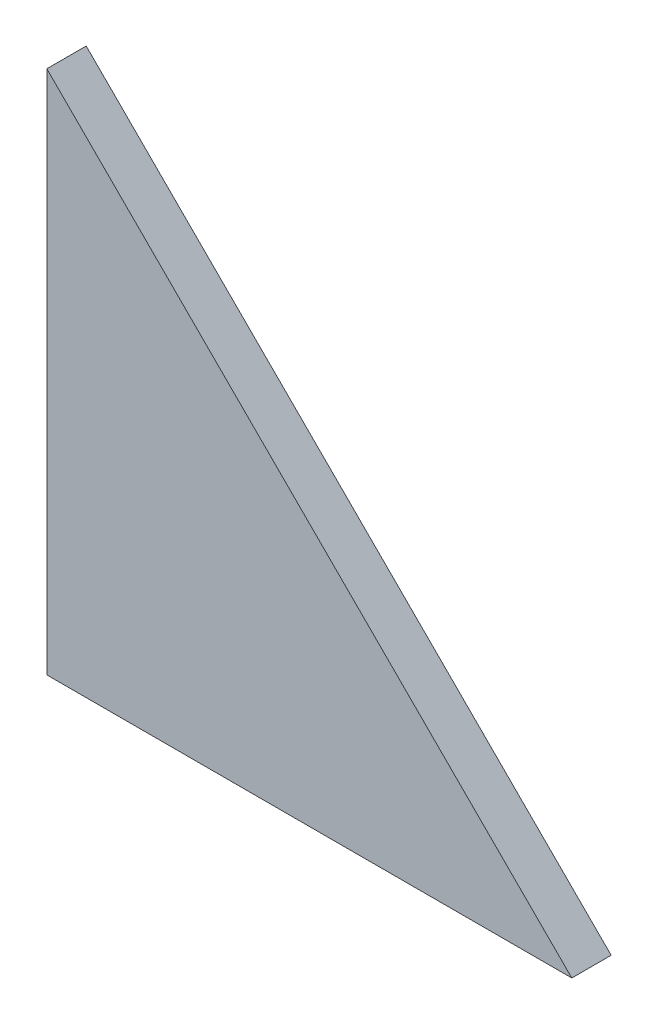
ISO-10303-21;
HEADER;
FILE_DESCRIPTION(('STEP AP214'),'2;1');
FILE_NAME('part.step','',(''),(''),'','','');
FILE_SCHEMA(('AUTOMOTIVE_DESIGN { 1 0 10303 214 1 1 1 1 }'));
ENDSEC;
DATA;
#1=APPLICATION_CONTEXT('core data for automotive mechanical design processes');
#2=APPLICATION_PROTOCOL_DEFINITION('international standard','automotive_design',2000,#1);
#3=PRODUCT_CONTEXT('',#1,'mechanical');
#4=PRODUCT('Part','Part','',(#3));
#5=PRODUCT_RELATED_PRODUCT_CATEGORY('part','',(#4));
#6=PRODUCT_DEFINITION_FORMATION('','',#4);
#7=PRODUCT_DEFINITION_CONTEXT('part definition',#1,'design');
#8=PRODUCT_DEFINITION('design','',#6,#7);
#9=PRODUCT_DEFINITION_SHAPE('','',#8);
#10=(LENGTH_UNIT() NAMED_UNIT(*) SI_UNIT(.MILLI.,.METRE.));
#11=(NAMED_UNIT(*) PLANE_ANGLE_UNIT() SI_UNIT($,.RADIAN.));
#12=(NAMED_UNIT(*) SI_UNIT($,.STERADIAN.) SOLID_ANGLE_UNIT());
#13=UNCERTAINTY_MEASURE_WITH_UNIT(LENGTH_MEASURE(1.E-05),#10,'distance_accuracy_value','');
#14=(GEOMETRIC_REPRESENTATION_CONTEXT(3) GLOBAL_UNCERTAINTY_ASSIGNED_CONTEXT((#13)) GLOBAL_UNIT_ASSIGNED_CONTEXT((#10,
#11,#12)) REPRESENTATION_CONTEXT('',''));
#15=CARTESIAN_POINT('',(0.,0.,0.));
#16=DIRECTION('',(0.,0.,1.));
#17=DIRECTION('',(1.,0.,0.));
#18=AXIS2_PLACEMENT_3D('',#15,#16,#17);
#19=CARTESIAN_POINT('',(0.,0.,1.5));
#20=DIRECTION('',(0.,0.,-1.));
#21=DIRECTION('',(-1.,0.,0.));
#22=AXIS2_PLACEMENT_3D('',#19,#20,#21);
#23=PLANE('',#22);
#24=DIRECTION('',(0.707106781186548,-0.707106781186548,0.));
#25=VECTOR('',#24,1.);
#26=CARTESIAN_POINT('',(10.,10.,1.5));
#27=LINE('',#26,#25);
#28=CARTESIAN_POINT('',(0.,20.,1.5));
#29=VERTEX_POINT('',#28);
#30=CARTESIAN_POINT('',(20.,0.,1.5));
#31=VERTEX_POINT('',#30);
#32=EDGE_CURVE('E67',#29,#31,#27,.T.);
#33=ORIENTED_EDGE('',*,*,#32,.F.);
#34=DIRECTION('',(0.,-1.,0.));
#35=VECTOR('',#34,1.);
#36=CARTESIAN_POINT('',(0.,0.,1.5));
#37=LINE('',#36,#35);
#38=CARTESIAN_POINT('',(0.,0.,1.5));
#39=VERTEX_POINT('',#38);
#40=EDGE_CURVE('E80',#29,#39,#37,.T.);
#41=ORIENTED_EDGE('',*,*,#40,.T.);
#42=DIRECTION('',(1.,0.,0.));
#43=VECTOR('',#42,1.);
#44=CARTESIAN_POINT('',(0.,0.,1.5));
#45=LINE('',#44,#43);
#46=EDGE_CURVE('E50',#39,#31,#45,.T.);
#47=ORIENTED_EDGE('',*,*,#46,.T.);
#48=EDGE_LOOP('',(#33,#41,#47));
#49=FACE_BOUND('',#48,.T.);
#50=ADVANCED_FACE('F34',(#49),#23,.F.);
#51=CARTESIAN_POINT('',(0.,0.,0.));
#52=DIRECTION('',(0.,0.,-1.));
#53=DIRECTION('',(-1.,0.,0.));
#54=AXIS2_PLACEMENT_3D('',#51,#52,#53);
#55=PLANE('',#54);
#56=DIRECTION('',(0.,-1.,0.));
#57=VECTOR('',#56,1.);
#58=CARTESIAN_POINT('',(0.,0.,0.));
#59=LINE('',#58,#57);
#60=CARTESIAN_POINT('',(0.,20.,0.));
#61=VERTEX_POINT('',#60);
#62=CARTESIAN_POINT('',(0.,0.,0.));
#63=VERTEX_POINT('',#62);
#64=EDGE_CURVE('E82',#61,#63,#59,.T.);
#65=ORIENTED_EDGE('',*,*,#64,.F.);
#66=DIRECTION('',(0.707106781186548,-0.707106781186548,0.));
#67=VECTOR('',#66,1.);
#68=CARTESIAN_POINT('',(10.,10.,0.));
#69=LINE('',#68,#67);
#70=CARTESIAN_POINT('',(20.,0.,0.));
#71=VERTEX_POINT('',#70);
#72=EDGE_CURVE('E11',#61,#71,#69,.T.);
#73=ORIENTED_EDGE('',*,*,#72,.T.);
#74=DIRECTION('',(1.,0.,0.));
#75=VECTOR('',#74,1.);
#76=CARTESIAN_POINT('',(0.,0.,0.));
#77=LINE('',#76,#75);
#78=EDGE_CURVE('E61',#63,#71,#77,.T.);
#79=ORIENTED_EDGE('',*,*,#78,.F.);
#80=EDGE_LOOP('',(#65,#73,#79));
#81=FACE_BOUND('',#80,.T.);
#82=ADVANCED_FACE('F90',(#81),#55,.T.);
#83=CARTESIAN_POINT('',(0.,0.,1.5));
#84=DIRECTION('',(1.,0.,0.));
#85=DIRECTION('',(0.,0.,-1.));
#86=AXIS2_PLACEMENT_3D('',#83,#84,#85);
#87=PLANE('',#86);
#88=ORIENTED_EDGE('',*,*,#64,.T.);
#89=DIRECTION('',(0.,0.,-1.));
#90=VECTOR('',#89,1.);
#91=CARTESIAN_POINT('',(0.,0.,1.5));
#92=LINE('',#91,#90);
#93=EDGE_CURVE('E43',#39,#63,#92,.T.);
#94=ORIENTED_EDGE('',*,*,#93,.F.);
#95=ORIENTED_EDGE('',*,*,#40,.F.);
#96=DIRECTION('',(0.,0.,-1.));
#97=VECTOR('',#96,1.);
#98=CARTESIAN_POINT('',(0.,20.,1.5));
#99=LINE('',#98,#97);
#100=EDGE_CURVE('E72',#29,#61,#99,.T.);
#101=ORIENTED_EDGE('',*,*,#100,.T.);
#102=EDGE_LOOP('',(#88,#94,#95,#101));
#103=FACE_BOUND('',#102,.T.);
#104=ADVANCED_FACE('F36',(#103),#87,.F.);
#105=CARTESIAN_POINT('',(0.,0.,1.5));
#106=DIRECTION('',(0.,1.,0.));
#107=DIRECTION('',(0.,0.,1.));
#108=AXIS2_PLACEMENT_3D('',#105,#106,#107);
#109=PLANE('',#108);
#110=ORIENTED_EDGE('',*,*,#78,.T.);
#111=DIRECTION('',(0.,0.,-1.));
#112=VECTOR('',#111,1.);
#113=CARTESIAN_POINT('',(20.,0.,1.5));
#114=LINE('',#113,#112);
#115=EDGE_CURVE('E77',#31,#71,#114,.T.);
#116=ORIENTED_EDGE('',*,*,#115,.F.);
#117=ORIENTED_EDGE('',*,*,#46,.F.);
#118=ORIENTED_EDGE('',*,*,#93,.T.);
#119=EDGE_LOOP('',(#110,#116,#117,#118));
#120=FACE_BOUND('',#119,.T.);
#121=ADVANCED_FACE('F89',(#120),#109,.F.);
#122=CARTESIAN_POINT('',(0.,20.,38.7800225956714));
#123=DIRECTION('',(0.707106781186548,0.707106781186548,0.));
#124=DIRECTION('',(-0.707106781186548,0.707106781186548,0.));
#125=AXIS2_PLACEMENT_3D('',#122,#123,#124);
#126=PLANE('',#125);
#127=ORIENTED_EDGE('',*,*,#100,.F.);
#128=ORIENTED_EDGE('',*,*,#32,.T.);
#129=ORIENTED_EDGE('',*,*,#115,.T.);
#130=ORIENTED_EDGE('',*,*,#72,.F.);
#131=EDGE_LOOP('',(#127,#128,#129,#130));
#132=FACE_BOUND('',#131,.T.);
#133=ADVANCED_FACE('F73',(#132),#126,.T.);
#134=CLOSED_SHELL('',(#50,#82,#104,#121,#133));
#135=MANIFOLD_SOLID_BREP('B2',#134);
#136=ADVANCED_BREP_SHAPE_REPRESENTATION('',(#18,#135),#14);
#137=SHAPE_DEFINITION_REPRESENTATION(#9,#136);
ENDSEC;
END-ISO-10303-21;
